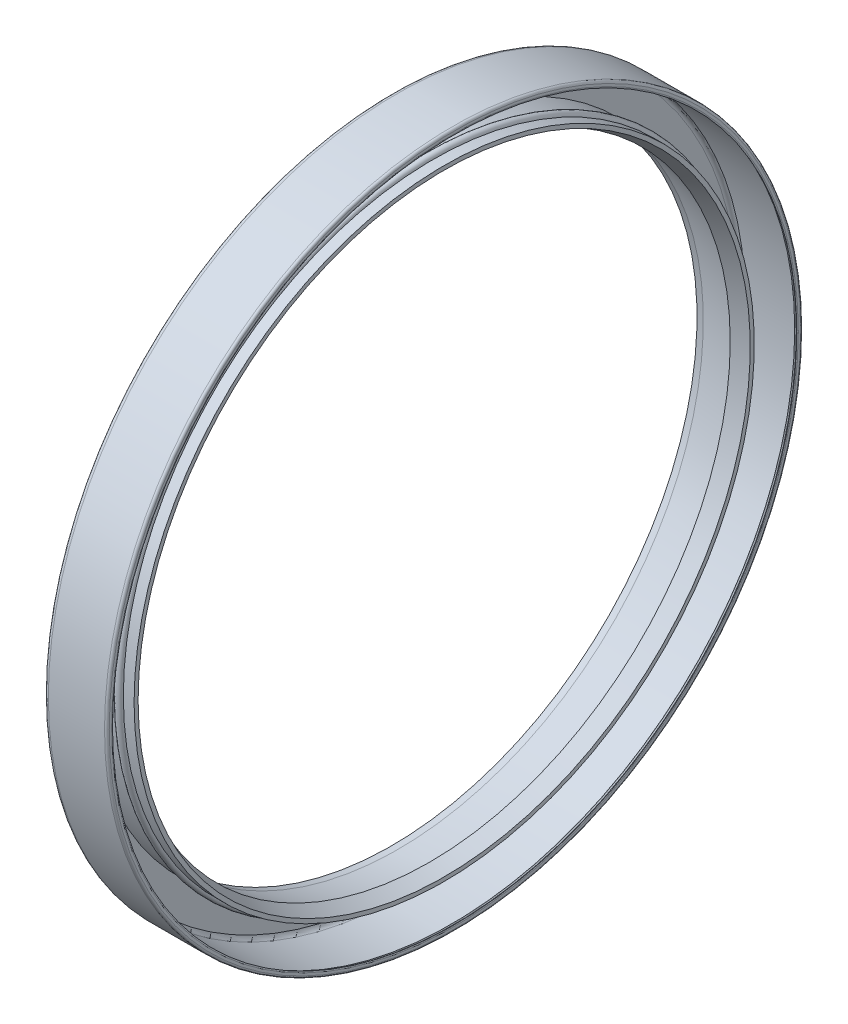
ISO-10303-21;
HEADER;
FILE_DESCRIPTION(('STEP AP214'),'2;1');
FILE_NAME('part.step','',(''),(''),'','','');
FILE_SCHEMA(('AUTOMOTIVE_DESIGN { 1 0 10303 214 1 1 1 1 }'));
ENDSEC;
DATA;
#1=APPLICATION_CONTEXT('core data for automotive mechanical design processes');
#2=APPLICATION_PROTOCOL_DEFINITION('international standard','automotive_design',2000,#1);
#3=PRODUCT_CONTEXT('',#1,'mechanical');
#4=PRODUCT('Part','Part','',(#3));
#5=PRODUCT_RELATED_PRODUCT_CATEGORY('part','',(#4));
#6=PRODUCT_DEFINITION_FORMATION('','',#4);
#7=PRODUCT_DEFINITION_CONTEXT('part definition',#1,'design');
#8=PRODUCT_DEFINITION('design','',#6,#7);
#9=PRODUCT_DEFINITION_SHAPE('','',#8);
#10=(LENGTH_UNIT() NAMED_UNIT(*) SI_UNIT(.MILLI.,.METRE.));
#11=(NAMED_UNIT(*) PLANE_ANGLE_UNIT() SI_UNIT($,.RADIAN.));
#12=(NAMED_UNIT(*) SI_UNIT($,.STERADIAN.) SOLID_ANGLE_UNIT());
#13=UNCERTAINTY_MEASURE_WITH_UNIT(LENGTH_MEASURE(1.E-05),#10,'distance_accuracy_value','');
#14=(GEOMETRIC_REPRESENTATION_CONTEXT(3) GLOBAL_UNCERTAINTY_ASSIGNED_CONTEXT((#13)) GLOBAL_UNIT_ASSIGNED_CONTEXT((#10,
#11,#12)) REPRESENTATION_CONTEXT('',''));
#15=CARTESIAN_POINT('',(0.,0.,0.));
#16=DIRECTION('',(0.,0.,1.));
#17=DIRECTION('',(1.,0.,0.));
#18=AXIS2_PLACEMENT_3D('',#15,#16,#17);
#19=CARTESIAN_POINT('',(0.749999999999851,0.,0.));
#20=DIRECTION('',(-1.,0.,0.));
#21=DIRECTION('',(0.,0.,1.));
#22=AXIS2_PLACEMENT_3D('',#19,#20,#21);
#23=TOROIDAL_SURFACE('',#22,54.2500000000001,0.749999999999853);
#24=CARTESIAN_POINT('',(0.,0.,0.));
#25=DIRECTION('',(-1.,0.,0.));
#26=DIRECTION('',(0.,0.,1.));
#27=AXIS2_PLACEMENT_3D('',#24,#25,#26);
#28=CIRCLE('',#27,54.25);
#29=CARTESIAN_POINT('',(0.,0.,54.25));
#30=VERTEX_POINT('',#29);
#31=EDGE_CURVE('E10',#30,#30,#28,.T.);
#32=ORIENTED_EDGE('',*,*,#31,.F.);
#33=EDGE_LOOP('',(#32));
#34=FACE_BOUND('',#33,.T.);
#35=CARTESIAN_POINT('',(0.750000000000001,0.,0.));
#36=DIRECTION('',(-1.,0.,0.));
#37=DIRECTION('',(0.,0.,1.));
#38=AXIS2_PLACEMENT_3D('',#35,#36,#37);
#39=CIRCLE('',#38,55.);
#40=CARTESIAN_POINT('',(0.750000000000001,0.,55.));
#41=VERTEX_POINT('',#40);
#42=EDGE_CURVE('E89',#41,#41,#39,.T.);
#43=ORIENTED_EDGE('',*,*,#42,.T.);
#44=EDGE_LOOP('',(#43));
#45=FACE_BOUND('',#44,.T.);
#46=ADVANCED_FACE('F31',(#34,#45),#23,.T.);
#47=CARTESIAN_POINT('',(0.,54.25,0.));
#48=DIRECTION('',(1.,0.,0.));
#49=DIRECTION('',(0.,0.,-1.));
#50=AXIS2_PLACEMENT_3D('',#47,#48,#49);
#51=PLANE('',#50);
#52=CARTESIAN_POINT('',(0.,0.,0.));
#53=DIRECTION('',(-1.,0.,0.));
#54=DIRECTION('',(0.,0.,1.));
#55=AXIS2_PLACEMENT_3D('',#52,#53,#54);
#56=CIRCLE('',#55,48.25);
#57=CARTESIAN_POINT('',(0.,0.,48.25));
#58=VERTEX_POINT('',#57);
#59=EDGE_CURVE('E37',#58,#58,#56,.T.);
#60=ORIENTED_EDGE('',*,*,#59,.F.);
#61=EDGE_LOOP('',(#60));
#62=FACE_BOUND('',#61,.T.);
#63=ORIENTED_EDGE('',*,*,#31,.T.);
#64=EDGE_LOOP('',(#63));
#65=FACE_BOUND('',#64,.T.);
#66=ADVANCED_FACE('F186',(#62,#65),#51,.F.);
#67=CARTESIAN_POINT('',(50.,0.,0.));
#68=DIRECTION('',(-1.,0.,0.));
#69=DIRECTION('',(0.,0.,1.));
#70=AXIS2_PLACEMENT_3D('',#67,#68,#69);
#71=CYLINDRICAL_SURFACE('',#70,48.25);
#72=CARTESIAN_POINT('',(1.,0.,0.));
#73=DIRECTION('',(-1.,0.,0.));
#74=DIRECTION('',(0.,0.,1.));
#75=AXIS2_PLACEMENT_3D('',#72,#73,#74);
#76=CIRCLE('',#75,48.25);
#77=CARTESIAN_POINT('',(1.,0.,48.25));
#78=VERTEX_POINT('',#77);
#79=EDGE_CURVE('E41',#78,#78,#76,.T.);
#80=ORIENTED_EDGE('',*,*,#79,.F.);
#81=EDGE_LOOP('',(#80));
#82=FACE_BOUND('',#81,.T.);
#83=ORIENTED_EDGE('',*,*,#59,.T.);
#84=EDGE_LOOP('',(#83));
#85=FACE_BOUND('',#84,.T.);
#86=ADVANCED_FACE('F181',(#82,#85),#71,.F.);
#87=CARTESIAN_POINT('',(1.,0.,0.));
#88=DIRECTION('',(-1.,0.,0.));
#89=DIRECTION('',(0.,0.,1.));
#90=AXIS2_PLACEMENT_3D('',#87,#88,#89);
#91=CONICAL_SURFACE('',#90,48.25,0.148889947609497);
#92=CARTESIAN_POINT('',(6.,0.,0.));
#93=DIRECTION('',(-1.,0.,0.));
#94=DIRECTION('',(0.,0.,1.));
#95=AXIS2_PLACEMENT_3D('',#92,#93,#94);
#96=CIRCLE('',#95,47.5);
#97=CARTESIAN_POINT('',(6.,0.,47.5));
#98=VERTEX_POINT('',#97);
#99=EDGE_CURVE('E45',#98,#98,#96,.T.);
#100=ORIENTED_EDGE('',*,*,#99,.F.);
#101=EDGE_LOOP('',(#100));
#102=FACE_BOUND('',#101,.T.);
#103=ORIENTED_EDGE('',*,*,#79,.T.);
#104=EDGE_LOOP('',(#103));
#105=FACE_BOUND('',#104,.T.);
#106=ADVANCED_FACE('F175',(#102,#105),#91,.F.);
#107=CARTESIAN_POINT('',(6.,0.,0.));
#108=DIRECTION('',(1.,0.,0.));
#109=DIRECTION('',(0.,0.,-1.));
#110=AXIS2_PLACEMENT_3D('',#107,#108,#109);
#111=CONICAL_SURFACE('',#110,47.5,0.358770670270573);
#112=CARTESIAN_POINT('',(8.3,0.,0.));
#113=DIRECTION('',(-1.,0.,0.));
#114=DIRECTION('',(0.,0.,1.));
#115=AXIS2_PLACEMENT_3D('',#112,#113,#114);
#116=CIRCLE('',#115,48.3625);
#117=CARTESIAN_POINT('',(8.3,0.,48.3625));
#118=VERTEX_POINT('',#117);
#119=EDGE_CURVE('E50',#118,#118,#116,.T.);
#120=ORIENTED_EDGE('',*,*,#119,.F.);
#121=EDGE_LOOP('',(#120));
#122=FACE_BOUND('',#121,.T.);
#123=ORIENTED_EDGE('',*,*,#99,.T.);
#124=EDGE_LOOP('',(#123));
#125=FACE_BOUND('',#124,.T.);
#126=ADVANCED_FACE('F169',(#122,#125),#111,.F.);
#127=CARTESIAN_POINT('',(8.3,48.3625,0.));
#128=DIRECTION('',(-1.,0.,0.));
#129=DIRECTION('',(0.,0.,1.));
#130=AXIS2_PLACEMENT_3D('',#127,#128,#129);
#131=PLANE('',#130);
#132=CARTESIAN_POINT('',(8.3,0.,0.));
#133=DIRECTION('',(-1.,0.,0.));
#134=DIRECTION('',(0.,0.,1.));
#135=AXIS2_PLACEMENT_3D('',#132,#133,#134);
#136=CIRCLE('',#135,49.);
#137=CARTESIAN_POINT('',(8.3,0.,49.));
#138=VERTEX_POINT('',#137);
#139=EDGE_CURVE('E53',#138,#138,#136,.T.);
#140=ORIENTED_EDGE('',*,*,#139,.F.);
#141=EDGE_LOOP('',(#140));
#142=FACE_BOUND('',#141,.T.);
#143=ORIENTED_EDGE('',*,*,#119,.T.);
#144=EDGE_LOOP('',(#143));
#145=FACE_BOUND('',#144,.T.);
#146=ADVANCED_FACE('F163',(#142,#145),#131,.F.);
#147=CARTESIAN_POINT('',(50.,0.,0.));
#148=DIRECTION('',(-1.,0.,0.));
#149=DIRECTION('',(0.,0.,1.));
#150=AXIS2_PLACEMENT_3D('',#147,#148,#149);
#151=CYLINDRICAL_SURFACE('',#150,49.);
#152=CARTESIAN_POINT('',(6.6,0.,0.));
#153=DIRECTION('',(-1.,0.,0.));
#154=DIRECTION('',(0.,0.,1.));
#155=AXIS2_PLACEMENT_3D('',#152,#153,#154);
#156=CIRCLE('',#155,49.);
#157=CARTESIAN_POINT('',(6.6,0.,49.));
#158=VERTEX_POINT('',#157);
#159=EDGE_CURVE('E56',#158,#158,#156,.T.);
#160=ORIENTED_EDGE('',*,*,#159,.F.);
#161=EDGE_LOOP('',(#160));
#162=FACE_BOUND('',#161,.T.);
#163=ORIENTED_EDGE('',*,*,#139,.T.);
#164=EDGE_LOOP('',(#163));
#165=FACE_BOUND('',#164,.T.);
#166=ADVANCED_FACE('F157',(#162,#165),#151,.T.);
#167=CARTESIAN_POINT('',(6.,0.,0.));
#168=DIRECTION('',(-1.,0.,0.));
#169=DIRECTION('',(0.,0.,1.));
#170=AXIS2_PLACEMENT_3D('',#167,#168,#169);
#171=TOROIDAL_SURFACE('',#170,49.,0.6);
#172=CARTESIAN_POINT('',(5.4,0.,0.));
#173=DIRECTION('',(-1.,0.,0.));
#174=DIRECTION('',(0.,0.,1.));
#175=AXIS2_PLACEMENT_3D('',#172,#173,#174);
#176=CIRCLE('',#175,49.);
#177=CARTESIAN_POINT('',(5.4,0.,49.));
#178=VERTEX_POINT('',#177);
#179=EDGE_CURVE('E59',#178,#178,#176,.T.);
#180=ORIENTED_EDGE('',*,*,#179,.F.);
#181=EDGE_LOOP('',(#180));
#182=FACE_BOUND('',#181,.T.);
#183=ORIENTED_EDGE('',*,*,#159,.T.);
#184=EDGE_LOOP('',(#183));
#185=FACE_BOUND('',#184,.T.);
#186=ADVANCED_FACE('F151',(#182,#185),#171,.T.);
#187=CARTESIAN_POINT('',(50.,0.,0.));
#188=DIRECTION('',(-1.,0.,0.));
#189=DIRECTION('',(0.,0.,1.));
#190=AXIS2_PLACEMENT_3D('',#187,#188,#189);
#191=CYLINDRICAL_SURFACE('',#190,49.);
#192=CARTESIAN_POINT('',(1.,0.,0.));
#193=DIRECTION('',(-1.,0.,0.));
#194=DIRECTION('',(0.,0.,1.));
#195=AXIS2_PLACEMENT_3D('',#192,#193,#194);
#196=CIRCLE('',#195,49.);
#197=CARTESIAN_POINT('',(1.,0.,49.));
#198=VERTEX_POINT('',#197);
#199=EDGE_CURVE('E62',#198,#198,#196,.T.);
#200=ORIENTED_EDGE('',*,*,#199,.F.);
#201=EDGE_LOOP('',(#200));
#202=FACE_BOUND('',#201,.T.);
#203=ORIENTED_EDGE('',*,*,#179,.T.);
#204=EDGE_LOOP('',(#203));
#205=FACE_BOUND('',#204,.T.);
#206=ADVANCED_FACE('F145',(#202,#205),#191,.T.);
#207=CARTESIAN_POINT('',(1.,49.,0.));
#208=DIRECTION('',(-1.,0.,0.));
#209=DIRECTION('',(0.,0.,1.));
#210=AXIS2_PLACEMENT_3D('',#207,#208,#209);
#211=PLANE('',#210);
#212=CARTESIAN_POINT('',(1.,0.,0.));
#213=DIRECTION('',(-1.,0.,0.));
#214=DIRECTION('',(0.,0.,1.));
#215=AXIS2_PLACEMENT_3D('',#212,#213,#214);
#216=CIRCLE('',#215,53.65);
#217=CARTESIAN_POINT('',(1.,0.,53.65));
#218=VERTEX_POINT('',#217);
#219=EDGE_CURVE('E65',#218,#218,#216,.T.);
#220=ORIENTED_EDGE('',*,*,#219,.F.);
#221=EDGE_LOOP('',(#220));
#222=FACE_BOUND('',#221,.T.);
#223=ORIENTED_EDGE('',*,*,#199,.T.);
#224=EDGE_LOOP('',(#223));
#225=FACE_BOUND('',#224,.T.);
#226=ADVANCED_FACE('F139',(#222,#225),#211,.F.);
#227=CARTESIAN_POINT('',(1.59999999999993,0.,0.));
#228=DIRECTION('',(-1.,0.,0.));
#229=DIRECTION('',(0.,0.,1.));
#230=AXIS2_PLACEMENT_3D('',#227,#228,#229);
#231=TOROIDAL_SURFACE('',#230,53.6500000000001,0.599999999999932);
#232=CARTESIAN_POINT('',(1.6,0.,0.));
#233=DIRECTION('',(-1.,0.,0.));
#234=DIRECTION('',(0.,0.,1.));
#235=AXIS2_PLACEMENT_3D('',#232,#233,#234);
#236=CIRCLE('',#235,54.25);
#237=CARTESIAN_POINT('',(1.6,0.,54.25));
#238=VERTEX_POINT('',#237);
#239=EDGE_CURVE('E68',#238,#238,#236,.T.);
#240=ORIENTED_EDGE('',*,*,#239,.F.);
#241=EDGE_LOOP('',(#240));
#242=FACE_BOUND('',#241,.T.);
#243=ORIENTED_EDGE('',*,*,#219,.T.);
#244=EDGE_LOOP('',(#243));
#245=FACE_BOUND('',#244,.T.);
#246=ADVANCED_FACE('F133',(#242,#245),#231,.F.);
#247=CARTESIAN_POINT('',(50.,0.,0.));
#248=DIRECTION('',(-1.,0.,0.));
#249=DIRECTION('',(0.,0.,1.));
#250=AXIS2_PLACEMENT_3D('',#247,#248,#249);
#251=CYLINDRICAL_SURFACE('',#250,54.25);
#252=CARTESIAN_POINT('',(9.4375,0.,0.));
#253=DIRECTION('',(-1.,0.,0.));
#254=DIRECTION('',(0.,0.,1.));
#255=AXIS2_PLACEMENT_3D('',#252,#253,#254);
#256=CIRCLE('',#255,54.25);
#257=CARTESIAN_POINT('',(9.4375,0.,54.25));
#258=VERTEX_POINT('',#257);
#259=EDGE_CURVE('E71',#258,#258,#256,.T.);
#260=ORIENTED_EDGE('',*,*,#259,.F.);
#261=EDGE_LOOP('',(#260));
#262=FACE_BOUND('',#261,.T.);
#263=ORIENTED_EDGE('',*,*,#239,.T.);
#264=EDGE_LOOP('',(#263));
#265=FACE_BOUND('',#264,.T.);
#266=ADVANCED_FACE('F127',(#262,#265),#251,.F.);
#267=CARTESIAN_POINT('',(9.62499999999997,0.,0.));
#268=DIRECTION('',(-1.,0.,0.));
#269=DIRECTION('',(0.,0.,1.));
#270=AXIS2_PLACEMENT_3D('',#267,#268,#269);
#271=TOROIDAL_SURFACE('',#270,54.2499999999998,0.187499999999965);
#272=CARTESIAN_POINT('',(9.78737976320961,0.,0.));
#273=DIRECTION('',(-1.,0.,0.));
#274=DIRECTION('',(0.,0.,1.));
#275=AXIS2_PLACEMENT_3D('',#272,#273,#274);
#276=CIRCLE('',#275,54.15625);
#277=CARTESIAN_POINT('',(9.78737976320961,0.,54.15625));
#278=VERTEX_POINT('',#277);
#279=EDGE_CURVE('E74',#278,#278,#276,.T.);
#280=ORIENTED_EDGE('',*,*,#279,.F.);
#281=EDGE_LOOP('',(#280));
#282=FACE_BOUND('',#281,.T.);
#283=ORIENTED_EDGE('',*,*,#259,.T.);
#284=EDGE_LOOP('',(#283));
#285=FACE_BOUND('',#284,.T.);
#286=ADVANCED_FACE('F121',(#282,#285),#271,.F.);
#287=CARTESIAN_POINT('',(9.78737976320961,0.,0.));
#288=DIRECTION('',(-1.,0.,0.));
#289=DIRECTION('',(0.,0.,1.));
#290=AXIS2_PLACEMENT_3D('',#287,#288,#289);
#291=CONICAL_SURFACE('',#290,54.15625,0.523598775598276);
#292=CARTESIAN_POINT('',(9.9497595264192,0.,0.));
#293=DIRECTION('',(-1.,0.,0.));
#294=DIRECTION('',(0.,0.,1.));
#295=AXIS2_PLACEMENT_3D('',#292,#293,#294);
#296=CIRCLE('',#295,54.0625);
#297=CARTESIAN_POINT('',(9.9497595264192,0.,54.0625));
#298=VERTEX_POINT('',#297);
#299=EDGE_CURVE('E77',#298,#298,#296,.T.);
#300=ORIENTED_EDGE('',*,*,#299,.F.);
#301=EDGE_LOOP('',(#300));
#302=FACE_BOUND('',#301,.T.);
#303=ORIENTED_EDGE('',*,*,#279,.T.);
#304=EDGE_LOOP('',(#303));
#305=FACE_BOUND('',#304,.T.);
#306=ADVANCED_FACE('F115',(#302,#305),#291,.F.);
#307=CARTESIAN_POINT('',(9.62499999999997,0.,0.));
#308=DIRECTION('',(-1.,0.,0.));
#309=DIRECTION('',(0.,0.,1.));
#310=AXIS2_PLACEMENT_3D('',#307,#308,#309);
#311=TOROIDAL_SURFACE('',#310,54.2499999999998,0.375000000000007);
#312=CARTESIAN_POINT('',(9.99999999999997,0.,0.));
#313=DIRECTION('',(-1.,0.,0.));
#314=DIRECTION('',(0.,0.,1.));
#315=AXIS2_PLACEMENT_3D('',#312,#313,#314);
#316=CIRCLE('',#315,54.25);
#317=CARTESIAN_POINT('',(9.99999999999997,0.,54.25));
#318=VERTEX_POINT('',#317);
#319=EDGE_CURVE('E80',#318,#318,#316,.T.);
#320=ORIENTED_EDGE('',*,*,#319,.F.);
#321=EDGE_LOOP('',(#320));
#322=FACE_BOUND('',#321,.T.);
#323=ORIENTED_EDGE('',*,*,#299,.T.);
#324=EDGE_LOOP('',(#323));
#325=FACE_BOUND('',#324,.T.);
#326=ADVANCED_FACE('F109',(#322,#325),#311,.T.);
#327=CARTESIAN_POINT('',(9.99999999999999,54.25,0.));
#328=DIRECTION('',(-1.,0.,0.));
#329=DIRECTION('',(0.,0.,1.));
#330=AXIS2_PLACEMENT_3D('',#327,#328,#329);
#331=PLANE('',#330);
#332=CARTESIAN_POINT('',(10.,0.,0.));
#333=DIRECTION('',(-1.,0.,0.));
#334=DIRECTION('',(0.,0.,1.));
#335=AXIS2_PLACEMENT_3D('',#332,#333,#334);
#336=CIRCLE('',#335,54.625);
#337=CARTESIAN_POINT('',(10.,0.,54.625));
#338=VERTEX_POINT('',#337);
#339=EDGE_CURVE('E83',#338,#338,#336,.T.);
#340=ORIENTED_EDGE('',*,*,#339,.F.);
#341=EDGE_LOOP('',(#340));
#342=FACE_BOUND('',#341,.T.);
#343=ORIENTED_EDGE('',*,*,#319,.T.);
#344=EDGE_LOOP('',(#343));
#345=FACE_BOUND('',#344,.T.);
#346=ADVANCED_FACE('F103',(#342,#345),#331,.F.);
#347=CARTESIAN_POINT('',(9.62500000000015,0.,0.));
#348=DIRECTION('',(-1.,0.,0.));
#349=DIRECTION('',(0.,0.,1.));
#350=AXIS2_PLACEMENT_3D('',#347,#348,#349);
#351=TOROIDAL_SURFACE('',#350,54.6250000000001,0.374999999999848);
#352=CARTESIAN_POINT('',(9.625,0.,0.));
#353=DIRECTION('',(-1.,0.,0.));
#354=DIRECTION('',(0.,0.,1.));
#355=AXIS2_PLACEMENT_3D('',#352,#353,#354);
#356=CIRCLE('',#355,55.);
#357=CARTESIAN_POINT('',(9.625,0.,55.));
#358=VERTEX_POINT('',#357);
#359=EDGE_CURVE('E86',#358,#358,#356,.T.);
#360=ORIENTED_EDGE('',*,*,#359,.F.);
#361=EDGE_LOOP('',(#360));
#362=FACE_BOUND('',#361,.T.);
#363=ORIENTED_EDGE('',*,*,#339,.T.);
#364=EDGE_LOOP('',(#363));
#365=FACE_BOUND('',#364,.T.);
#366=ADVANCED_FACE('F97',(#362,#365),#351,.T.);
#367=CARTESIAN_POINT('',(50.,0.,0.));
#368=DIRECTION('',(-1.,0.,0.));
#369=DIRECTION('',(0.,0.,1.));
#370=AXIS2_PLACEMENT_3D('',#367,#368,#369);
#371=CYLINDRICAL_SURFACE('',#370,55.);
#372=ORIENTED_EDGE('',*,*,#42,.F.);
#373=EDGE_LOOP('',(#372));
#374=FACE_BOUND('',#373,.T.);
#375=ORIENTED_EDGE('',*,*,#359,.T.);
#376=EDGE_LOOP('',(#375));
#377=FACE_BOUND('',#376,.T.);
#378=ADVANCED_FACE('F94',(#374,#377),#371,.T.);
#379=CLOSED_SHELL('',(#46,#66,#86,#106,#126,#146,#166,#186,#206,#226,#246,#266,#286,#306,#326,
#346,#366,#378));
#380=MANIFOLD_SOLID_BREP('B2',#379);
#381=ADVANCED_BREP_SHAPE_REPRESENTATION('',(#18,#380),#14);
#382=SHAPE_DEFINITION_REPRESENTATION(#9,#381);
ENDSEC;
END-ISO-10303-21;
